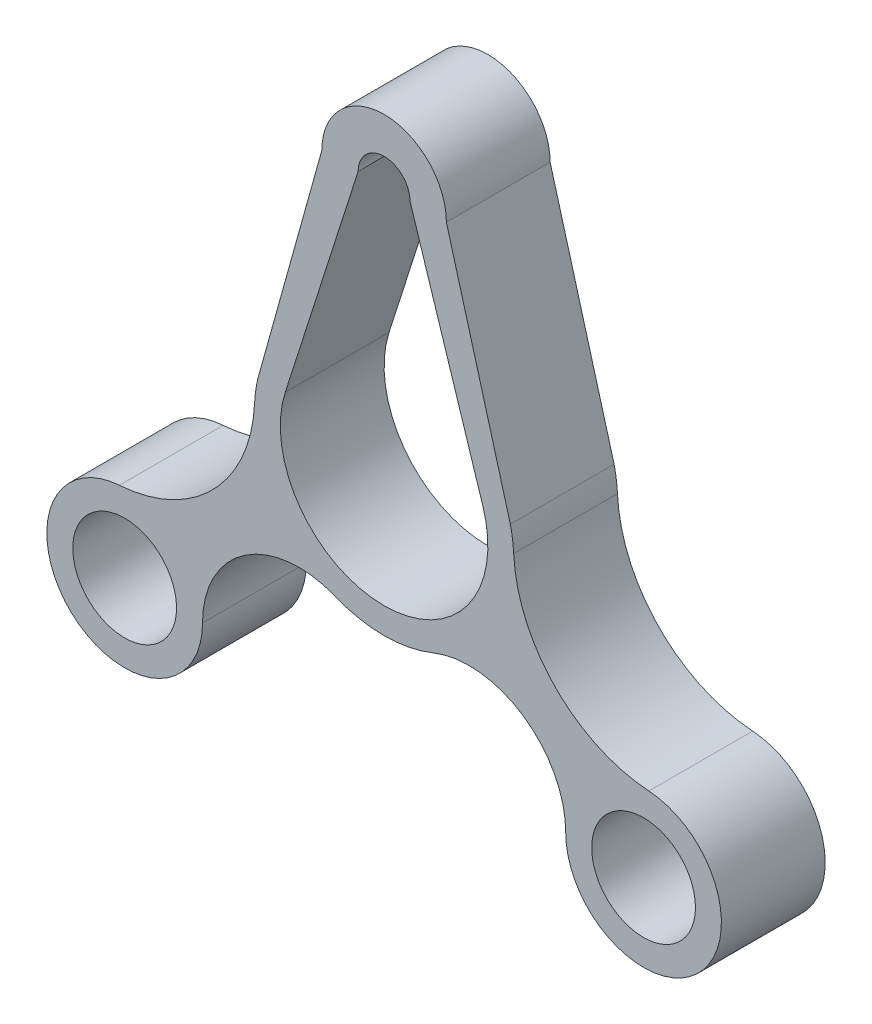
ISO-10303-21;
HEADER;
FILE_DESCRIPTION(('STEP AP214'),'2;1');
FILE_NAME('part.step','',(''),(''),'','','');
FILE_SCHEMA(('AUTOMOTIVE_DESIGN { 1 0 10303 214 1 1 1 1 }'));
ENDSEC;
DATA;
#1=APPLICATION_CONTEXT('core data for automotive mechanical design processes');
#2=APPLICATION_PROTOCOL_DEFINITION('international standard','automotive_design',2000,#1);
#3=PRODUCT_CONTEXT('',#1,'mechanical');
#4=PRODUCT('Part','Part','',(#3));
#5=PRODUCT_RELATED_PRODUCT_CATEGORY('part','',(#4));
#6=PRODUCT_DEFINITION_FORMATION('','',#4);
#7=PRODUCT_DEFINITION_CONTEXT('part definition',#1,'design');
#8=PRODUCT_DEFINITION('design','',#6,#7);
#9=PRODUCT_DEFINITION_SHAPE('','',#8);
#10=(LENGTH_UNIT() NAMED_UNIT(*) SI_UNIT(.MILLI.,.METRE.));
#11=(NAMED_UNIT(*) PLANE_ANGLE_UNIT() SI_UNIT($,.RADIAN.));
#12=(NAMED_UNIT(*) SI_UNIT($,.STERADIAN.) SOLID_ANGLE_UNIT());
#13=UNCERTAINTY_MEASURE_WITH_UNIT(LENGTH_MEASURE(1.E-05),#10,'distance_accuracy_value','');
#14=(GEOMETRIC_REPRESENTATION_CONTEXT(3) GLOBAL_UNCERTAINTY_ASSIGNED_CONTEXT((#13)) GLOBAL_UNIT_ASSIGNED_CONTEXT((#10,
#11,#12)) REPRESENTATION_CONTEXT('',''));
#15=CARTESIAN_POINT('',(0.,0.,0.));
#16=DIRECTION('',(0.,0.,1.));
#17=DIRECTION('',(1.,0.,0.));
#18=AXIS2_PLACEMENT_3D('',#15,#16,#17);
#19=CARTESIAN_POINT('',(0.,50.,10.));
#20=DIRECTION('',(0.,0.,-1.));
#21=DIRECTION('',(-1.,0.,0.));
#22=AXIS2_PLACEMENT_3D('',#19,#20,#21);
#23=CYLINDRICAL_SURFACE('',#22,5.);
#24=CARTESIAN_POINT('',(0.,50.,-10.));
#25=DIRECTION('',(0.,0.,1.));
#26=DIRECTION('',(1.,0.,0.));
#27=AXIS2_PLACEMENT_3D('',#24,#25,#26);
#28=CIRCLE('',#27,5.);
#29=CARTESIAN_POINT('',(5.,50.,-10.));
#30=VERTEX_POINT('',#29);
#31=CARTESIAN_POINT('',(-5.,50.,-10.));
#32=VERTEX_POINT('',#31);
#33=EDGE_CURVE('E224',#30,#32,#28,.T.);
#34=ORIENTED_EDGE('',*,*,#33,.F.);
#35=DIRECTION('',(0.,0.,-1.));
#36=VECTOR('',#35,1.);
#37=CARTESIAN_POINT('',(5.,50.,10.));
#38=LINE('',#37,#36);
#39=CARTESIAN_POINT('',(5.,50.,10.));
#40=VERTEX_POINT('',#39);
#41=EDGE_CURVE('E11',#40,#30,#38,.T.);
#42=ORIENTED_EDGE('',*,*,#41,.F.);
#43=CARTESIAN_POINT('',(0.,50.,10.));
#44=DIRECTION('',(0.,0.,1.));
#45=DIRECTION('',(1.,0.,0.));
#46=AXIS2_PLACEMENT_3D('',#43,#44,#45);
#47=CIRCLE('',#46,5.);
#48=CARTESIAN_POINT('',(-5.,50.,10.));
#49=VERTEX_POINT('',#48);
#50=EDGE_CURVE('E170',#40,#49,#47,.T.);
#51=ORIENTED_EDGE('',*,*,#50,.T.);
#52=DIRECTION('',(0.,0.,-1.));
#53=VECTOR('',#52,1.);
#54=CARTESIAN_POINT('',(-5.,50.,10.));
#55=LINE('',#54,#53);
#56=EDGE_CURVE('E62',#49,#32,#55,.T.);
#57=ORIENTED_EDGE('',*,*,#56,.T.);
#58=EDGE_LOOP('',(#34,#42,#51,#57));
#59=FACE_BOUND('',#58,.T.);
#60=ADVANCED_FACE('F43',(#59),#23,.F.);
#61=CARTESIAN_POINT('',(19.0486028857285,6.09513971142715,10.));
#62=DIRECTION('',(0.952430144286425,0.304756985571357,0.));
#63=DIRECTION('',(-0.304756985571357,0.952430144286425,0.));
#64=AXIS2_PLACEMENT_3D('',#61,#62,#63);
#65=PLANE('',#64);
#66=DIRECTION('',(0.304756985571357,-0.952430144286425,0.));
#67=VECTOR('',#66,1.);
#68=CARTESIAN_POINT('',(19.0486028857285,6.09513971142715,-10.));
#69=LINE('',#68,#67);
#70=CARTESIAN_POINT('',(19.0486028857285,6.09513971142715,-10.));
#71=VERTEX_POINT('',#70);
#72=EDGE_CURVE('E176',#30,#71,#69,.T.);
#73=ORIENTED_EDGE('',*,*,#72,.T.);
#74=DIRECTION('',(0.,0.,-1.));
#75=VECTOR('',#74,1.);
#76=CARTESIAN_POINT('',(19.0486028857285,6.09513971142715,10.));
#77=LINE('',#76,#75);
#78=CARTESIAN_POINT('',(19.0486028857285,6.09513971142715,10.));
#79=VERTEX_POINT('',#78);
#80=EDGE_CURVE('E53',#79,#71,#77,.T.);
#81=ORIENTED_EDGE('',*,*,#80,.F.);
#82=DIRECTION('',(0.304756985571357,-0.952430144286425,0.));
#83=VECTOR('',#82,1.);
#84=CARTESIAN_POINT('',(19.0486028857285,6.09513971142715,10.));
#85=LINE('',#84,#83);
#86=EDGE_CURVE('E164',#40,#79,#85,.T.);
#87=ORIENTED_EDGE('',*,*,#86,.F.);
#88=ORIENTED_EDGE('',*,*,#41,.T.);
#89=EDGE_LOOP('',(#73,#81,#87,#88));
#90=FACE_BOUND('',#89,.T.);
#91=ADVANCED_FACE('F174',(#90),#65,.F.);
#92=CARTESIAN_POINT('',(0.,0.,10.));
#93=DIRECTION('',(0.,0.,-1.));
#94=DIRECTION('',(-1.,0.,0.));
#95=AXIS2_PLACEMENT_3D('',#92,#93,#94);
#96=CYLINDRICAL_SURFACE('',#95,20.);
#97=CARTESIAN_POINT('',(0.,0.,-10.));
#98=DIRECTION('',(0.,0.,1.));
#99=DIRECTION('',(1.,0.,0.));
#100=AXIS2_PLACEMENT_3D('',#97,#98,#99);
#101=CIRCLE('',#100,20.);
#102=CARTESIAN_POINT('',(-19.0486028857285,6.09513971142715,-10.));
#103=VERTEX_POINT('',#102);
#104=EDGE_CURVE('E227',#103,#71,#101,.T.);
#105=ORIENTED_EDGE('',*,*,#104,.F.);
#106=DIRECTION('',(0.,0.,-1.));
#107=VECTOR('',#106,1.);
#108=CARTESIAN_POINT('',(-19.0486028857285,6.09513971142715,10.));
#109=LINE('',#108,#107);
#110=CARTESIAN_POINT('',(-19.0486028857285,6.09513971142715,10.));
#111=VERTEX_POINT('',#110);
#112=EDGE_CURVE('E111',#111,#103,#109,.T.);
#113=ORIENTED_EDGE('',*,*,#112,.F.);
#114=CARTESIAN_POINT('',(0.,0.,10.));
#115=DIRECTION('',(0.,0.,1.));
#116=DIRECTION('',(1.,0.,0.));
#117=AXIS2_PLACEMENT_3D('',#114,#115,#116);
#118=CIRCLE('',#117,20.);
#119=EDGE_CURVE('E169',#111,#79,#118,.T.);
#120=ORIENTED_EDGE('',*,*,#119,.T.);
#121=ORIENTED_EDGE('',*,*,#80,.T.);
#122=EDGE_LOOP('',(#105,#113,#120,#121));
#123=FACE_BOUND('',#122,.T.);
#124=ADVANCED_FACE('F180',(#123),#96,.F.);
#125=CARTESIAN_POINT('',(52.9273995146868,2.51041599990977,10.));
#126=DIRECTION('',(0.,0.,-1.));
#127=DIRECTION('',(-1.,0.,0.));
#128=AXIS2_PLACEMENT_3D('',#125,#126,#127);
#129=CYLINDRICAL_SURFACE('',#128,27.9869022295121);
#130=CARTESIAN_POINT('',(52.9273995146868,2.51041599990977,-10.));
#131=DIRECTION('',(0.,0.,1.));
#132=DIRECTION('',(1.,0.,0.));
#133=AXIS2_PLACEMENT_3D('',#130,#131,#132);
#134=CIRCLE('',#133,27.9869022295121);
#135=CARTESIAN_POINT('',(24.9719257437586,1.18445120127799,-10.));
#136=VERTEX_POINT('',#135);
#137=CARTESIAN_POINT('',(51.0214970245089,-25.4115150239682,-10.));
#138=VERTEX_POINT('',#137);
#139=EDGE_CURVE('E187',#136,#138,#134,.T.);
#140=ORIENTED_EDGE('',*,*,#139,.F.);
#141=DIRECTION('',(0.,0.,-1.));
#142=VECTOR('',#141,1.);
#143=CARTESIAN_POINT('',(24.9719257437586,1.18445120127799,10.));
#144=LINE('',#143,#142);
#145=CARTESIAN_POINT('',(24.9719257437586,1.18445120127799,10.));
#146=VERTEX_POINT('',#145);
#147=EDGE_CURVE('E47',#146,#136,#144,.T.);
#148=ORIENTED_EDGE('',*,*,#147,.F.);
#149=CARTESIAN_POINT('',(52.9273995146868,2.51041599990977,10.));
#150=DIRECTION('',(0.,0.,1.));
#151=DIRECTION('',(1.,0.,0.));
#152=AXIS2_PLACEMENT_3D('',#149,#150,#151);
#153=CIRCLE('',#152,27.9869022295121);
#154=CARTESIAN_POINT('',(51.0214970245089,-25.4115150239682,10.));
#155=VERTEX_POINT('',#154);
#156=EDGE_CURVE('E232',#146,#155,#153,.T.);
#157=ORIENTED_EDGE('',*,*,#156,.T.);
#158=DIRECTION('',(0.,0.,-1.));
#159=VECTOR('',#158,1.);
#160=CARTESIAN_POINT('',(51.0214970245089,-25.4115150239682,10.));
#161=LINE('',#160,#159);
#162=EDGE_CURVE('E183',#155,#138,#161,.T.);
#163=ORIENTED_EDGE('',*,*,#162,.T.);
#164=EDGE_LOOP('',(#140,#148,#157,#163));
#165=FACE_BOUND('',#164,.T.);
#166=ADVANCED_FACE('F45',(#165),#129,.F.);
#167=CARTESIAN_POINT('',(0.,0.,10.));
#168=DIRECTION('',(0.,0.,-1.));
#169=DIRECTION('',(-1.,0.,0.));
#170=AXIS2_PLACEMENT_3D('',#167,#168,#169);
#171=CYLINDRICAL_SURFACE('',#170,25.);
#172=CARTESIAN_POINT('',(0.,0.,-10.));
#173=DIRECTION('',(0.,0.,1.));
#174=DIRECTION('',(1.,0.,0.));
#175=AXIS2_PLACEMENT_3D('',#172,#173,#174);
#176=CIRCLE('',#175,25.);
#177=CARTESIAN_POINT('',(24.3242758552492,5.77317972331894,-10.));
#178=VERTEX_POINT('',#177);
#179=EDGE_CURVE('E190',#136,#178,#176,.T.);
#180=ORIENTED_EDGE('',*,*,#179,.T.);
#181=DIRECTION('',(0.,0.,-1.));
#182=VECTOR('',#181,1.);
#183=CARTESIAN_POINT('',(24.3242758552492,5.77317972331894,10.));
#184=LINE('',#183,#182);
#185=CARTESIAN_POINT('',(24.3242758552492,5.77317972331894,10.));
#186=VERTEX_POINT('',#185);
#187=EDGE_CURVE('E258',#186,#178,#184,.T.);
#188=ORIENTED_EDGE('',*,*,#187,.F.);
#189=CARTESIAN_POINT('',(0.,0.,10.));
#190=DIRECTION('',(0.,0.,1.));
#191=DIRECTION('',(1.,0.,0.));
#192=AXIS2_PLACEMENT_3D('',#189,#190,#191);
#193=CIRCLE('',#192,25.);
#194=EDGE_CURVE('E266',#146,#186,#193,.T.);
#195=ORIENTED_EDGE('',*,*,#194,.F.);
#196=ORIENTED_EDGE('',*,*,#147,.T.);
#197=EDGE_LOOP('',(#180,#188,#195,#196));
#198=FACE_BOUND('',#197,.T.);
#199=ADVANCED_FACE('F265',(#198),#171,.T.);
#200=CARTESIAN_POINT('',(24.0643913433803,6.70579967877234,10.));
#201=DIRECTION('',(0.963298259696273,0.268433349020072,0.));
#202=DIRECTION('',(-0.268433349020072,0.963298259696273,0.));
#203=AXIS2_PLACEMENT_3D('',#200,#201,#202);
#204=PLANE('',#203);
#205=DIRECTION('',(0.268433349020072,-0.963298259696273,0.));
#206=VECTOR('',#205,1.);
#207=CARTESIAN_POINT('',(24.0643913433803,6.70579967877234,-10.));
#208=LINE('',#207,#206);
#209=CARTESIAN_POINT('',(12.,50.,-10.));
#210=VERTEX_POINT('',#209);
#211=EDGE_CURVE('E193',#210,#178,#208,.T.);
#212=ORIENTED_EDGE('',*,*,#211,.F.);
#213=DIRECTION('',(0.,0.,-1.));
#214=VECTOR('',#213,1.);
#215=CARTESIAN_POINT('',(12.,50.,10.));
#216=LINE('',#215,#214);
#217=CARTESIAN_POINT('',(12.,50.,10.));
#218=VERTEX_POINT('',#217);
#219=EDGE_CURVE('E257',#218,#210,#216,.T.);
#220=ORIENTED_EDGE('',*,*,#219,.F.);
#221=DIRECTION('',(0.268433349020072,-0.963298259696273,0.));
#222=VECTOR('',#221,1.);
#223=CARTESIAN_POINT('',(24.0643913433803,6.70579967877234,10.));
#224=LINE('',#223,#222);
#225=EDGE_CURVE('E326',#218,#186,#224,.T.);
#226=ORIENTED_EDGE('',*,*,#225,.T.);
#227=ORIENTED_EDGE('',*,*,#187,.T.);
#228=EDGE_LOOP('',(#212,#220,#226,#227));
#229=FACE_BOUND('',#228,.T.);
#230=ADVANCED_FACE('F325',(#229),#204,.T.);
#231=CARTESIAN_POINT('',(0.,50.,10.));
#232=DIRECTION('',(0.,0.,-1.));
#233=DIRECTION('',(-1.,0.,0.));
#234=AXIS2_PLACEMENT_3D('',#231,#232,#233);
#235=CYLINDRICAL_SURFACE('',#234,12.);
#236=CARTESIAN_POINT('',(0.,50.,-10.));
#237=DIRECTION('',(0.,0.,1.));
#238=DIRECTION('',(1.,0.,0.));
#239=AXIS2_PLACEMENT_3D('',#236,#237,#238);
#240=CIRCLE('',#239,12.);
#241=CARTESIAN_POINT('',(-12.,50.,-10.));
#242=VERTEX_POINT('',#241);
#243=EDGE_CURVE('E196',#210,#242,#240,.T.);
#244=ORIENTED_EDGE('',*,*,#243,.T.);
#245=DIRECTION('',(0.,0.,-1.));
#246=VECTOR('',#245,1.);
#247=CARTESIAN_POINT('',(-12.,50.,10.));
#248=LINE('',#247,#246);
#249=CARTESIAN_POINT('',(-12.,50.,10.));
#250=VERTEX_POINT('',#249);
#251=EDGE_CURVE('E254',#250,#242,#248,.T.);
#252=ORIENTED_EDGE('',*,*,#251,.F.);
#253=CARTESIAN_POINT('',(0.,50.,10.));
#254=DIRECTION('',(0.,0.,1.));
#255=DIRECTION('',(1.,0.,0.));
#256=AXIS2_PLACEMENT_3D('',#253,#254,#255);
#257=CIRCLE('',#256,12.);
#258=EDGE_CURVE('E323',#218,#250,#257,.T.);
#259=ORIENTED_EDGE('',*,*,#258,.F.);
#260=ORIENTED_EDGE('',*,*,#219,.T.);
#261=EDGE_LOOP('',(#244,#252,#259,#260));
#262=FACE_BOUND('',#261,.T.);
#263=ADVANCED_FACE('F322',(#262),#235,.T.);
#264=CARTESIAN_POINT('',(-24.0643913433803,6.70579967877234,10.));
#265=DIRECTION('',(0.963298259696273,-0.268433349020072,0.));
#266=DIRECTION('',(0.268433349020072,0.963298259696273,0.));
#267=AXIS2_PLACEMENT_3D('',#264,#265,#266);
#268=PLANE('',#267);
#269=DIRECTION('',(-0.268433349020072,-0.963298259696273,0.));
#270=VECTOR('',#269,1.);
#271=CARTESIAN_POINT('',(-24.0643913433803,6.70579967877234,-10.));
#272=LINE('',#271,#270);
#273=CARTESIAN_POINT('',(-24.3242758552492,5.77317972331894,-10.));
#274=VERTEX_POINT('',#273);
#275=EDGE_CURVE('E198',#242,#274,#272,.T.);
#276=ORIENTED_EDGE('',*,*,#275,.T.);
#277=DIRECTION('',(0.,0.,-1.));
#278=VECTOR('',#277,1.);
#279=CARTESIAN_POINT('',(-24.3242758552492,5.77317972331894,10.));
#280=LINE('',#279,#278);
#281=CARTESIAN_POINT('',(-24.3242758552492,5.77317972331894,10.));
#282=VERTEX_POINT('',#281);
#283=EDGE_CURVE('E251',#282,#274,#280,.T.);
#284=ORIENTED_EDGE('',*,*,#283,.F.);
#285=DIRECTION('',(-0.268433349020072,-0.963298259696273,0.));
#286=VECTOR('',#285,1.);
#287=CARTESIAN_POINT('',(-24.0643913433803,6.70579967877234,10.));
#288=LINE('',#287,#286);
#289=EDGE_CURVE('E319',#250,#282,#288,.T.);
#290=ORIENTED_EDGE('',*,*,#289,.F.);
#291=ORIENTED_EDGE('',*,*,#251,.T.);
#292=EDGE_LOOP('',(#276,#284,#290,#291));
#293=FACE_BOUND('',#292,.T.);
#294=ADVANCED_FACE('F316',(#293),#268,.F.);
#295=CARTESIAN_POINT('',(0.,0.,10.));
#296=DIRECTION('',(0.,0.,-1.));
#297=DIRECTION('',(-1.,0.,0.));
#298=AXIS2_PLACEMENT_3D('',#295,#296,#297);
#299=CYLINDRICAL_SURFACE('',#298,25.);
#300=CARTESIAN_POINT('',(0.,0.,-10.));
#301=DIRECTION('',(0.,0.,1.));
#302=DIRECTION('',(1.,0.,0.));
#303=AXIS2_PLACEMENT_3D('',#300,#301,#302);
#304=CIRCLE('',#303,25.);
#305=CARTESIAN_POINT('',(-24.9719257437586,1.18445120127798,-10.));
#306=VERTEX_POINT('',#305);
#307=EDGE_CURVE('E200',#274,#306,#304,.T.);
#308=ORIENTED_EDGE('',*,*,#307,.T.);
#309=DIRECTION('',(0.,0.,-1.));
#310=VECTOR('',#309,1.);
#311=CARTESIAN_POINT('',(-24.9719257437586,1.18445120127798,10.));
#312=LINE('',#311,#310);
#313=CARTESIAN_POINT('',(-24.9719257437586,1.18445120127798,10.));
#314=VERTEX_POINT('',#313);
#315=EDGE_CURVE('E248',#314,#306,#312,.T.);
#316=ORIENTED_EDGE('',*,*,#315,.F.);
#317=CARTESIAN_POINT('',(0.,0.,10.));
#318=DIRECTION('',(0.,0.,1.));
#319=DIRECTION('',(1.,0.,0.));
#320=AXIS2_PLACEMENT_3D('',#317,#318,#319);
#321=CIRCLE('',#320,25.);
#322=EDGE_CURVE('E312',#282,#314,#321,.T.);
#323=ORIENTED_EDGE('',*,*,#322,.F.);
#324=ORIENTED_EDGE('',*,*,#283,.T.);
#325=EDGE_LOOP('',(#308,#316,#323,#324));
#326=FACE_BOUND('',#325,.T.);
#327=ADVANCED_FACE('F311',(#326),#299,.T.);
#328=CARTESIAN_POINT('',(-52.9273995146868,2.51041599990977,10.));
#329=DIRECTION('',(0.,0.,-1.));
#330=DIRECTION('',(-1.,0.,0.));
#331=AXIS2_PLACEMENT_3D('',#328,#329,#330);
#332=CYLINDRICAL_SURFACE('',#331,27.9869022295121);
#333=CARTESIAN_POINT('',(-52.9273995146868,2.51041599990977,-10.));
#334=DIRECTION('',(0.,0.,1.));
#335=DIRECTION('',(1.,0.,0.));
#336=AXIS2_PLACEMENT_3D('',#333,#334,#335);
#337=CIRCLE('',#336,27.9869022295121);
#338=CARTESIAN_POINT('',(-51.0214970245089,-25.4115150239682,-10.));
#339=VERTEX_POINT('',#338);
#340=EDGE_CURVE('E202',#306,#339,#337,.F.);
#341=ORIENTED_EDGE('',*,*,#340,.T.);
#342=DIRECTION('',(0.,0.,-1.));
#343=VECTOR('',#342,1.);
#344=CARTESIAN_POINT('',(-51.0214970245089,-25.4115150239682,10.));
#345=LINE('',#344,#343);
#346=CARTESIAN_POINT('',(-51.0214970245089,-25.4115150239682,10.));
#347=VERTEX_POINT('',#346);
#348=EDGE_CURVE('E246',#347,#339,#345,.T.);
#349=ORIENTED_EDGE('',*,*,#348,.F.);
#350=CARTESIAN_POINT('',(-52.9273995146868,2.51041599990977,10.));
#351=DIRECTION('',(0.,0.,1.));
#352=DIRECTION('',(1.,0.,0.));
#353=AXIS2_PLACEMENT_3D('',#350,#351,#352);
#354=CIRCLE('',#353,27.9869022295121);
#355=EDGE_CURVE('E308',#314,#347,#354,.F.);
#356=ORIENTED_EDGE('',*,*,#355,.F.);
#357=ORIENTED_EDGE('',*,*,#315,.T.);
#358=EDGE_LOOP('',(#341,#349,#356,#357));
#359=FACE_BOUND('',#358,.T.);
#360=ADVANCED_FACE('F306',(#359),#332,.F.);
#361=CARTESIAN_POINT('',(-50.,-40.3766927318647,10.));
#362=DIRECTION('',(0.,0.,-1.));
#363=DIRECTION('',(-1.,0.,0.));
#364=AXIS2_PLACEMENT_3D('',#361,#362,#363);
#365=CYLINDRICAL_SURFACE('',#364,15.);
#366=CARTESIAN_POINT('',(-50.,-40.3766927318647,-10.));
#367=DIRECTION('',(0.,0.,1.));
#368=DIRECTION('',(1.,0.,0.));
#369=AXIS2_PLACEMENT_3D('',#366,#367,#368);
#370=CIRCLE('',#369,15.);
#371=CARTESIAN_POINT('',(-35.,-40.3766927318647,-10.));
#372=VERTEX_POINT('',#371);
#373=EDGE_CURVE('E205',#372,#339,#370,.F.);
#374=ORIENTED_EDGE('',*,*,#373,.F.);
#375=DIRECTION('',(0.,0.,-1.));
#376=VECTOR('',#375,1.);
#377=CARTESIAN_POINT('',(-35.,-40.3766927318647,10.));
#378=LINE('',#377,#376);
#379=CARTESIAN_POINT('',(-35.,-40.3766927318647,10.));
#380=VERTEX_POINT('',#379);
#381=EDGE_CURVE('E244',#380,#372,#378,.T.);
#382=ORIENTED_EDGE('',*,*,#381,.F.);
#383=CARTESIAN_POINT('',(-50.,-40.3766927318647,10.));
#384=DIRECTION('',(0.,0.,1.));
#385=DIRECTION('',(1.,0.,0.));
#386=AXIS2_PLACEMENT_3D('',#383,#384,#385);
#387=CIRCLE('',#386,15.);
#388=EDGE_CURVE('E303',#380,#347,#387,.F.);
#389=ORIENTED_EDGE('',*,*,#388,.T.);
#390=ORIENTED_EDGE('',*,*,#348,.T.);
#391=EDGE_LOOP('',(#374,#382,#389,#390));
#392=FACE_BOUND('',#391,.T.);
#393=ADVANCED_FACE('F299',(#392),#365,.T.);
#394=CARTESIAN_POINT('',(-16.4143557003049,-40.3766927318647,10.));
#395=DIRECTION('',(0.,0.,-1.));
#396=DIRECTION('',(-1.,0.,0.));
#397=AXIS2_PLACEMENT_3D('',#394,#395,#396);
#398=CYLINDRICAL_SURFACE('',#397,18.5856442996951);
#399=CARTESIAN_POINT('',(-16.4143557003049,-40.3766927318647,-10.));
#400=DIRECTION('',(0.,0.,1.));
#401=DIRECTION('',(1.,0.,0.));
#402=AXIS2_PLACEMENT_3D('',#399,#400,#401);
#403=CIRCLE('',#402,18.5856442996951);
#404=CARTESIAN_POINT('',(-9.41500117988374,-23.1593988001154,-10.));
#405=VERTEX_POINT('',#404);
#406=EDGE_CURVE('E208',#405,#372,#403,.T.);
#407=ORIENTED_EDGE('',*,*,#406,.F.);
#408=DIRECTION('',(0.,0.,-1.));
#409=VECTOR('',#408,1.);
#410=CARTESIAN_POINT('',(-9.41500117988374,-23.1593988001154,10.));
#411=LINE('',#410,#409);
#412=CARTESIAN_POINT('',(-9.41500117988374,-23.1593988001154,10.));
#413=VERTEX_POINT('',#412);
#414=EDGE_CURVE('E242',#413,#405,#411,.T.);
#415=ORIENTED_EDGE('',*,*,#414,.F.);
#416=CARTESIAN_POINT('',(-16.4143557003049,-40.3766927318647,10.));
#417=DIRECTION('',(0.,0.,1.));
#418=DIRECTION('',(1.,0.,0.));
#419=AXIS2_PLACEMENT_3D('',#416,#417,#418);
#420=CIRCLE('',#419,18.5856442996951);
#421=EDGE_CURVE('E294',#413,#380,#420,.T.);
#422=ORIENTED_EDGE('',*,*,#421,.T.);
#423=ORIENTED_EDGE('',*,*,#381,.T.);
#424=EDGE_LOOP('',(#407,#415,#422,#423));
#425=FACE_BOUND('',#424,.T.);
#426=ADVANCED_FACE('F293',(#425),#398,.F.);
#427=CARTESIAN_POINT('',(0.,0.,10.));
#428=DIRECTION('',(0.,0.,-1.));
#429=DIRECTION('',(-1.,0.,0.));
#430=AXIS2_PLACEMENT_3D('',#427,#428,#429);
#431=CYLINDRICAL_SURFACE('',#430,25.);
#432=CARTESIAN_POINT('',(0.,0.,-10.));
#433=DIRECTION('',(0.,0.,1.));
#434=DIRECTION('',(1.,0.,0.));
#435=AXIS2_PLACEMENT_3D('',#432,#433,#434);
#436=CIRCLE('',#435,25.);
#437=CARTESIAN_POINT('',(9.41500117988374,-23.1593988001154,-10.));
#438=VERTEX_POINT('',#437);
#439=EDGE_CURVE('E211',#405,#438,#436,.T.);
#440=ORIENTED_EDGE('',*,*,#439,.T.);
#441=DIRECTION('',(0.,0.,-1.));
#442=VECTOR('',#441,1.);
#443=CARTESIAN_POINT('',(9.41500117988374,-23.1593988001154,10.));
#444=LINE('',#443,#442);
#445=CARTESIAN_POINT('',(9.41500117988374,-23.1593988001154,10.));
#446=VERTEX_POINT('',#445);
#447=EDGE_CURVE('E239',#446,#438,#444,.T.);
#448=ORIENTED_EDGE('',*,*,#447,.F.);
#449=CARTESIAN_POINT('',(0.,0.,10.));
#450=DIRECTION('',(0.,0.,1.));
#451=DIRECTION('',(1.,0.,0.));
#452=AXIS2_PLACEMENT_3D('',#449,#450,#451);
#453=CIRCLE('',#452,25.);
#454=EDGE_CURVE('E289',#413,#446,#453,.T.);
#455=ORIENTED_EDGE('',*,*,#454,.F.);
#456=ORIENTED_EDGE('',*,*,#414,.T.);
#457=EDGE_LOOP('',(#440,#448,#455,#456));
#458=FACE_BOUND('',#457,.T.);
#459=ADVANCED_FACE('F288',(#458),#431,.T.);
#460=CARTESIAN_POINT('',(16.4143557003049,-40.3766927318647,10.));
#461=DIRECTION('',(0.,0.,-1.));
#462=DIRECTION('',(-1.,0.,0.));
#463=AXIS2_PLACEMENT_3D('',#460,#461,#462);
#464=CYLINDRICAL_SURFACE('',#463,18.5856442996951);
#465=CARTESIAN_POINT('',(16.4143557003049,-40.3766927318647,-10.));
#466=DIRECTION('',(0.,0.,1.));
#467=DIRECTION('',(1.,0.,0.));
#468=AXIS2_PLACEMENT_3D('',#465,#466,#467);
#469=CIRCLE('',#468,18.5856442996951);
#470=CARTESIAN_POINT('',(35.,-40.3766927318647,-10.));
#471=VERTEX_POINT('',#470);
#472=EDGE_CURVE('E213',#438,#471,#469,.F.);
#473=ORIENTED_EDGE('',*,*,#472,.T.);
#474=DIRECTION('',(0.,0.,-1.));
#475=VECTOR('',#474,1.);
#476=CARTESIAN_POINT('',(35.,-40.3766927318647,10.));
#477=LINE('',#476,#475);
#478=CARTESIAN_POINT('',(35.,-40.3766927318647,10.));
#479=VERTEX_POINT('',#478);
#480=EDGE_CURVE('E236',#479,#471,#477,.T.);
#481=ORIENTED_EDGE('',*,*,#480,.F.);
#482=CARTESIAN_POINT('',(16.4143557003049,-40.3766927318647,10.));
#483=DIRECTION('',(0.,0.,1.));
#484=DIRECTION('',(1.,0.,0.));
#485=AXIS2_PLACEMENT_3D('',#482,#483,#484);
#486=CIRCLE('',#485,18.5856442996951);
#487=EDGE_CURVE('E285',#446,#479,#486,.F.);
#488=ORIENTED_EDGE('',*,*,#487,.F.);
#489=ORIENTED_EDGE('',*,*,#447,.T.);
#490=EDGE_LOOP('',(#473,#481,#488,#489));
#491=FACE_BOUND('',#490,.T.);
#492=ADVANCED_FACE('F282',(#491),#464,.F.);
#493=CARTESIAN_POINT('',(50.,-40.3766927318647,10.));
#494=DIRECTION('',(0.,0.,-1.));
#495=DIRECTION('',(-1.,0.,0.));
#496=AXIS2_PLACEMENT_3D('',#493,#494,#495);
#497=CYLINDRICAL_SURFACE('',#496,9.99999999999999);
#498=CARTESIAN_POINT('',(50.,-40.3766927318647,10.));
#499=DIRECTION('',(0.,0.,1.));
#500=DIRECTION('',(1.,0.,0.));
#501=AXIS2_PLACEMENT_3D('',#498,#499,#500);
#502=CIRCLE('',#501,9.99999999999999);
#503=CARTESIAN_POINT('',(60.,-40.3766927318647,10.));
#504=VERTEX_POINT('',#503);
#505=EDGE_CURVE('E345',#504,#504,#502,.T.);
#506=ORIENTED_EDGE('',*,*,#505,.T.);
#507=EDGE_LOOP('',(#506));
#508=FACE_BOUND('',#507,.T.);
#509=CARTESIAN_POINT('',(50.,-40.3766927318647,-10.));
#510=DIRECTION('',(0.,0.,1.));
#511=DIRECTION('',(1.,0.,0.));
#512=AXIS2_PLACEMENT_3D('',#509,#510,#511);
#513=CIRCLE('',#512,9.99999999999999);
#514=CARTESIAN_POINT('',(60.,-40.3766927318647,-10.));
#515=VERTEX_POINT('',#514);
#516=EDGE_CURVE('E221',#515,#515,#513,.T.);
#517=ORIENTED_EDGE('',*,*,#516,.F.);
#518=EDGE_LOOP('',(#517));
#519=FACE_BOUND('',#518,.T.);
#520=ADVANCED_FACE('F366',(#508,#519),#497,.F.);
#521=CARTESIAN_POINT('',(-50.,-40.3766927318647,10.));
#522=DIRECTION('',(0.,0.,-1.));
#523=DIRECTION('',(-1.,0.,0.));
#524=AXIS2_PLACEMENT_3D('',#521,#522,#523);
#525=CYLINDRICAL_SURFACE('',#524,9.99999999999999);
#526=CARTESIAN_POINT('',(-50.,-40.3766927318647,10.));
#527=DIRECTION('',(0.,0.,1.));
#528=DIRECTION('',(1.,0.,0.));
#529=AXIS2_PLACEMENT_3D('',#526,#527,#528);
#530=CIRCLE('',#529,9.99999999999999);
#531=CARTESIAN_POINT('',(-40.,-40.3766927318647,10.));
#532=VERTEX_POINT('',#531);
#533=EDGE_CURVE('E342',#532,#532,#530,.F.);
#534=ORIENTED_EDGE('',*,*,#533,.F.);
#535=EDGE_LOOP('',(#534));
#536=FACE_BOUND('',#535,.T.);
#537=CARTESIAN_POINT('',(-50.,-40.3766927318647,-10.));
#538=DIRECTION('',(0.,0.,1.));
#539=DIRECTION('',(1.,0.,0.));
#540=AXIS2_PLACEMENT_3D('',#537,#538,#539);
#541=CIRCLE('',#540,9.99999999999999);
#542=CARTESIAN_POINT('',(-40.,-40.3766927318647,-10.));
#543=VERTEX_POINT('',#542);
#544=EDGE_CURVE('E218',#543,#543,#541,.F.);
#545=ORIENTED_EDGE('',*,*,#544,.T.);
#546=EDGE_LOOP('',(#545));
#547=FACE_BOUND('',#546,.T.);
#548=ADVANCED_FACE('F355',(#536,#547),#525,.F.);
#549=CARTESIAN_POINT('',(50.,-40.3766927318647,10.));
#550=DIRECTION('',(0.,0.,-1.));
#551=DIRECTION('',(-1.,0.,0.));
#552=AXIS2_PLACEMENT_3D('',#549,#550,#551);
#553=CYLINDRICAL_SURFACE('',#552,15.);
#554=CARTESIAN_POINT('',(50.,-40.3766927318647,-10.));
#555=DIRECTION('',(0.,0.,1.));
#556=DIRECTION('',(1.,0.,0.));
#557=AXIS2_PLACEMENT_3D('',#554,#555,#556);
#558=CIRCLE('',#557,15.);
#559=EDGE_CURVE('E215',#471,#138,#558,.T.);
#560=ORIENTED_EDGE('',*,*,#559,.T.);
#561=ORIENTED_EDGE('',*,*,#162,.F.);
#562=CARTESIAN_POINT('',(50.,-40.3766927318647,10.));
#563=DIRECTION('',(0.,0.,1.));
#564=DIRECTION('',(1.,0.,0.));
#565=AXIS2_PLACEMENT_3D('',#562,#563,#564);
#566=CIRCLE('',#565,15.);
#567=EDGE_CURVE('E340',#479,#155,#566,.T.);
#568=ORIENTED_EDGE('',*,*,#567,.F.);
#569=ORIENTED_EDGE('',*,*,#480,.T.);
#570=EDGE_LOOP('',(#560,#561,#568,#569));
#571=FACE_BOUND('',#570,.T.);
#572=ADVANCED_FACE('F276',(#571),#553,.T.);
#573=CARTESIAN_POINT('',(-19.0486028857285,6.09513971142715,10.));
#574=DIRECTION('',(0.952430144286425,-0.304756985571357,0.));
#575=DIRECTION('',(0.304756985571357,0.952430144286425,0.));
#576=AXIS2_PLACEMENT_3D('',#573,#574,#575);
#577=PLANE('',#576);
#578=DIRECTION('',(-0.304756985571357,-0.952430144286425,0.));
#579=VECTOR('',#578,1.);
#580=CARTESIAN_POINT('',(-19.0486028857285,6.09513971142715,-10.));
#581=LINE('',#580,#579);
#582=EDGE_CURVE('E229',#32,#103,#581,.T.);
#583=ORIENTED_EDGE('',*,*,#582,.F.);
#584=ORIENTED_EDGE('',*,*,#56,.F.);
#585=DIRECTION('',(-0.304756985571357,-0.952430144286425,0.));
#586=VECTOR('',#585,1.);
#587=CARTESIAN_POINT('',(-19.0486028857285,6.09513971142715,10.));
#588=LINE('',#587,#586);
#589=EDGE_CURVE('E181',#49,#111,#588,.T.);
#590=ORIENTED_EDGE('',*,*,#589,.T.);
#591=ORIENTED_EDGE('',*,*,#112,.T.);
#592=EDGE_LOOP('',(#583,#584,#590,#591));
#593=FACE_BOUND('',#592,.T.);
#594=ADVANCED_FACE('F347',(#593),#577,.T.);
#595=CARTESIAN_POINT('',(0.,0.,10.));
#596=DIRECTION('',(0.,0.,1.));
#597=DIRECTION('',(1.,0.,0.));
#598=AXIS2_PLACEMENT_3D('',#595,#596,#597);
#599=PLANE('',#598);
#600=ORIENTED_EDGE('',*,*,#156,.F.);
#601=ORIENTED_EDGE('',*,*,#194,.T.);
#602=ORIENTED_EDGE('',*,*,#225,.F.);
#603=ORIENTED_EDGE('',*,*,#258,.T.);
#604=ORIENTED_EDGE('',*,*,#289,.T.);
#605=ORIENTED_EDGE('',*,*,#322,.T.);
#606=ORIENTED_EDGE('',*,*,#355,.T.);
#607=ORIENTED_EDGE('',*,*,#388,.F.);
#608=ORIENTED_EDGE('',*,*,#421,.F.);
#609=ORIENTED_EDGE('',*,*,#454,.T.);
#610=ORIENTED_EDGE('',*,*,#487,.T.);
#611=ORIENTED_EDGE('',*,*,#567,.T.);
#612=EDGE_LOOP('',(#600,#601,#602,#603,#604,#605,#606,#607,#608,#609,#610,#611));
#613=FACE_BOUND('',#612,.T.);
#614=ORIENTED_EDGE('',*,*,#533,.T.);
#615=EDGE_LOOP('',(#614));
#616=FACE_BOUND('',#615,.T.);
#617=ORIENTED_EDGE('',*,*,#505,.F.);
#618=EDGE_LOOP('',(#617));
#619=FACE_BOUND('',#618,.T.);
#620=ORIENTED_EDGE('',*,*,#50,.F.);
#621=ORIENTED_EDGE('',*,*,#86,.T.);
#622=ORIENTED_EDGE('',*,*,#119,.F.);
#623=ORIENTED_EDGE('',*,*,#589,.F.);
#624=EDGE_LOOP('',(#620,#621,#622,#623));
#625=FACE_BOUND('',#624,.T.);
#626=ADVANCED_FACE('F166',(#613,#616,#619,#625),#599,.T.);
#627=CARTESIAN_POINT('',(0.,0.,-10.));
#628=DIRECTION('',(0.,0.,1.));
#629=DIRECTION('',(1.,0.,0.));
#630=AXIS2_PLACEMENT_3D('',#627,#628,#629);
#631=PLANE('',#630);
#632=ORIENTED_EDGE('',*,*,#139,.T.);
#633=ORIENTED_EDGE('',*,*,#559,.F.);
#634=ORIENTED_EDGE('',*,*,#472,.F.);
#635=ORIENTED_EDGE('',*,*,#439,.F.);
#636=ORIENTED_EDGE('',*,*,#406,.T.);
#637=ORIENTED_EDGE('',*,*,#373,.T.);
#638=ORIENTED_EDGE('',*,*,#340,.F.);
#639=ORIENTED_EDGE('',*,*,#307,.F.);
#640=ORIENTED_EDGE('',*,*,#275,.F.);
#641=ORIENTED_EDGE('',*,*,#243,.F.);
#642=ORIENTED_EDGE('',*,*,#211,.T.);
#643=ORIENTED_EDGE('',*,*,#179,.F.);
#644=EDGE_LOOP('',(#632,#633,#634,#635,#636,#637,#638,#639,#640,#641,#642,#643));
#645=FACE_BOUND('',#644,.T.);
#646=ORIENTED_EDGE('',*,*,#544,.F.);
#647=EDGE_LOOP('',(#646));
#648=FACE_BOUND('',#647,.T.);
#649=ORIENTED_EDGE('',*,*,#516,.T.);
#650=EDGE_LOOP('',(#649));
#651=FACE_BOUND('',#650,.T.);
#652=ORIENTED_EDGE('',*,*,#33,.T.);
#653=ORIENTED_EDGE('',*,*,#582,.T.);
#654=ORIENTED_EDGE('',*,*,#104,.T.);
#655=ORIENTED_EDGE('',*,*,#72,.F.);
#656=EDGE_LOOP('',(#652,#653,#654,#655));
#657=FACE_BOUND('',#656,.T.);
#658=ADVANCED_FACE('F269',(#645,#648,#651,#657),#631,.F.);
#659=CLOSED_SHELL('',(#60,#91,#124,#166,#199,#230,#263,#294,#327,#360,#393,#426,#459,#492,#520,
#548,#572,#594,#626,#658));
#660=MANIFOLD_SOLID_BREP('B2',#659);
#661=ADVANCED_BREP_SHAPE_REPRESENTATION('',(#18,#660),#14);
#662=SHAPE_DEFINITION_REPRESENTATION(#9,#661);
ENDSEC;
END-ISO-10303-21;
